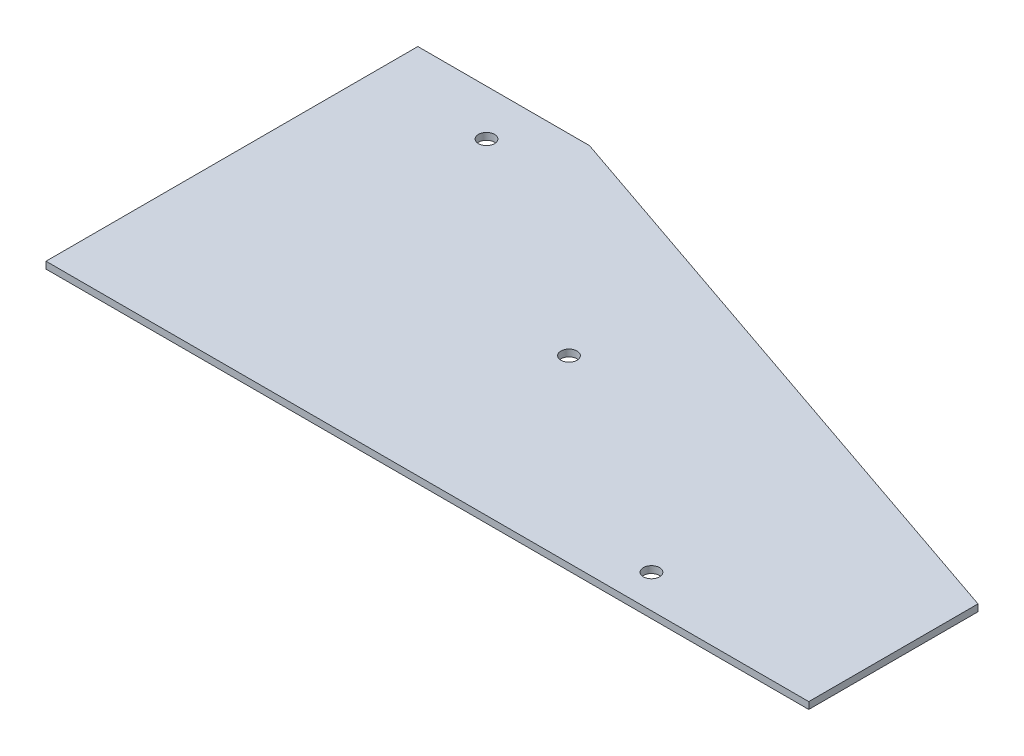
ISO-10303-21;
HEADER;
FILE_DESCRIPTION(('STEP AP214'),'2;1');
FILE_NAME('part.step','',(''),(''),'','','');
FILE_SCHEMA(('AUTOMOTIVE_DESIGN { 1 0 10303 214 1 1 1 1 }'));
ENDSEC;
DATA;
#1=APPLICATION_CONTEXT('core data for automotive mechanical design processes');
#2=APPLICATION_PROTOCOL_DEFINITION('international standard','automotive_design',2000,#1);
#3=PRODUCT_CONTEXT('',#1,'mechanical');
#4=PRODUCT('Part','Part','',(#3));
#5=PRODUCT_RELATED_PRODUCT_CATEGORY('part','',(#4));
#6=PRODUCT_DEFINITION_FORMATION('','',#4);
#7=PRODUCT_DEFINITION_CONTEXT('part definition',#1,'design');
#8=PRODUCT_DEFINITION('design','',#6,#7);
#9=PRODUCT_DEFINITION_SHAPE('','',#8);
#10=(LENGTH_UNIT() NAMED_UNIT(*) SI_UNIT(.MILLI.,.METRE.));
#11=(NAMED_UNIT(*) PLANE_ANGLE_UNIT() SI_UNIT($,.RADIAN.));
#12=(NAMED_UNIT(*) SI_UNIT($,.STERADIAN.) SOLID_ANGLE_UNIT());
#13=UNCERTAINTY_MEASURE_WITH_UNIT(LENGTH_MEASURE(1.E-05),#10,'distance_accuracy_value','');
#14=(GEOMETRIC_REPRESENTATION_CONTEXT(3) GLOBAL_UNCERTAINTY_ASSIGNED_CONTEXT((#13)) GLOBAL_UNIT_ASSIGNED_CONTEXT((#10,
#11,#12)) REPRESENTATION_CONTEXT('',''));
#15=CARTESIAN_POINT('',(0.,0.,0.));
#16=DIRECTION('',(0.,0.,1.));
#17=DIRECTION('',(1.,0.,0.));
#18=AXIS2_PLACEMENT_3D('',#15,#16,#17);
#19=CARTESIAN_POINT('',(0.,18.25625,0.));
#20=DIRECTION('',(1.,0.,0.));
#21=DIRECTION('',(0.,0.,-1.));
#22=AXIS2_PLACEMENT_3D('',#19,#20,#21);
#23=PLANE('',#22);
#24=DIRECTION('',(0.,0.,1.));
#25=VECTOR('',#24,1.);
#26=CARTESIAN_POINT('',(0.,0.,0.));
#27=LINE('',#26,#25);
#28=CARTESIAN_POINT('',(0.,0.,-990.6));
#29=VERTEX_POINT('',#28);
#30=CARTESIAN_POINT('',(0.,0.,0.));
#31=VERTEX_POINT('',#30);
#32=EDGE_CURVE('E106',#29,#31,#27,.T.);
#33=ORIENTED_EDGE('',*,*,#32,.T.);
#34=DIRECTION('',(0.,-1.,0.));
#35=VECTOR('',#34,1.);
#36=CARTESIAN_POINT('',(0.,18.25625,0.));
#37=LINE('',#36,#35);
#38=CARTESIAN_POINT('',(0.,18.25625,0.));
#39=VERTEX_POINT('',#38);
#40=EDGE_CURVE('E11',#39,#31,#37,.T.);
#41=ORIENTED_EDGE('',*,*,#40,.F.);
#42=DIRECTION('',(0.,0.,1.));
#43=VECTOR('',#42,1.);
#44=CARTESIAN_POINT('',(0.,18.25625,0.));
#45=LINE('',#44,#43);
#46=CARTESIAN_POINT('',(0.,18.25625,-990.6));
#47=VERTEX_POINT('',#46);
#48=EDGE_CURVE('E115',#47,#39,#45,.T.);
#49=ORIENTED_EDGE('',*,*,#48,.F.);
#50=DIRECTION('',(0.,-1.,0.));
#51=VECTOR('',#50,1.);
#52=CARTESIAN_POINT('',(0.,18.25625,-990.6));
#53=LINE('',#52,#51);
#54=EDGE_CURVE('E102',#47,#29,#53,.T.);
#55=ORIENTED_EDGE('',*,*,#54,.T.);
#56=EDGE_LOOP('',(#33,#41,#49,#55));
#57=FACE_BOUND('',#56,.T.);
#58=ADVANCED_FACE('F32',(#57),#23,.F.);
#59=CARTESIAN_POINT('',(0.,18.25625,0.));
#60=DIRECTION('',(0.,0.,-1.));
#61=DIRECTION('',(-1.,0.,0.));
#62=AXIS2_PLACEMENT_3D('',#59,#60,#61);
#63=PLANE('',#62);
#64=DIRECTION('',(1.,0.,0.));
#65=VECTOR('',#64,1.);
#66=CARTESIAN_POINT('',(0.,0.,0.));
#67=LINE('',#66,#65);
#68=CARTESIAN_POINT('',(2032.,0.,0.));
#69=VERTEX_POINT('',#68);
#70=EDGE_CURVE('E109',#31,#69,#67,.T.);
#71=ORIENTED_EDGE('',*,*,#70,.T.);
#72=DIRECTION('',(0.,-1.,0.));
#73=VECTOR('',#72,1.);
#74=CARTESIAN_POINT('',(2032.,18.25625,0.));
#75=LINE('',#74,#73);
#76=CARTESIAN_POINT('',(2032.,18.25625,0.));
#77=VERTEX_POINT('',#76);
#78=EDGE_CURVE('E40',#77,#69,#75,.T.);
#79=ORIENTED_EDGE('',*,*,#78,.F.);
#80=DIRECTION('',(1.,0.,0.));
#81=VECTOR('',#80,1.);
#82=CARTESIAN_POINT('',(0.,18.25625,0.));
#83=LINE('',#82,#81);
#84=EDGE_CURVE('E82',#39,#77,#83,.T.);
#85=ORIENTED_EDGE('',*,*,#84,.F.);
#86=ORIENTED_EDGE('',*,*,#40,.T.);
#87=EDGE_LOOP('',(#71,#79,#85,#86));
#88=FACE_BOUND('',#87,.T.);
#89=ADVANCED_FACE('F135',(#88),#63,.F.);
#90=CARTESIAN_POINT('',(2032.,18.25625,-450.85));
#91=DIRECTION('',(-1.,0.,0.));
#92=DIRECTION('',(0.,0.,1.));
#93=AXIS2_PLACEMENT_3D('',#90,#91,#92);
#94=PLANE('',#93);
#95=DIRECTION('',(0.,0.,-1.));
#96=VECTOR('',#95,1.);
#97=CARTESIAN_POINT('',(2032.,0.,-450.85));
#98=LINE('',#97,#96);
#99=CARTESIAN_POINT('',(2032.,0.,-450.85));
#100=VERTEX_POINT('',#99);
#101=EDGE_CURVE('E97',#69,#100,#98,.T.);
#102=ORIENTED_EDGE('',*,*,#101,.T.);
#103=DIRECTION('',(0.,-1.,0.));
#104=VECTOR('',#103,1.);
#105=CARTESIAN_POINT('',(2032.,18.25625,-450.85));
#106=LINE('',#105,#104);
#107=CARTESIAN_POINT('',(2032.,18.25625,-450.85));
#108=VERTEX_POINT('',#107);
#109=EDGE_CURVE('E94',#108,#100,#106,.T.);
#110=ORIENTED_EDGE('',*,*,#109,.F.);
#111=DIRECTION('',(0.,0.,-1.));
#112=VECTOR('',#111,1.);
#113=CARTESIAN_POINT('',(2032.,18.25625,-450.85));
#114=LINE('',#113,#112);
#115=EDGE_CURVE('E86',#77,#108,#114,.T.);
#116=ORIENTED_EDGE('',*,*,#115,.F.);
#117=ORIENTED_EDGE('',*,*,#78,.T.);
#118=EDGE_LOOP('',(#102,#110,#116,#117));
#119=FACE_BOUND('',#118,.T.);
#120=ADVANCED_FACE('F95',(#119),#94,.F.);
#121=CARTESIAN_POINT('',(2032.,18.25625,-450.85));
#122=DIRECTION('',(-0.32422680240075,0.,0.945979376416307));
#123=DIRECTION('',(0.945979376416307,0.,0.32422680240075));
#124=AXIS2_PLACEMENT_3D('',#121,#122,#123);
#125=PLANE('',#124);
#126=DIRECTION('',(-0.945979376416307,0.,-0.32422680240075));
#127=VECTOR('',#126,1.);
#128=CARTESIAN_POINT('',(2032.,0.,-450.85));
#129=LINE('',#128,#127);
#130=CARTESIAN_POINT('',(457.2,0.,-990.6));
#131=VERTEX_POINT('',#130);
#132=EDGE_CURVE('E68',#100,#131,#129,.T.);
#133=ORIENTED_EDGE('',*,*,#132,.T.);
#134=DIRECTION('',(0.,-1.,0.));
#135=VECTOR('',#134,1.);
#136=CARTESIAN_POINT('',(457.2,18.25625,-990.6));
#137=LINE('',#136,#135);
#138=CARTESIAN_POINT('',(457.2,18.25625,-990.6));
#139=VERTEX_POINT('',#138);
#140=EDGE_CURVE('E98',#139,#131,#137,.T.);
#141=ORIENTED_EDGE('',*,*,#140,.F.);
#142=DIRECTION('',(-0.945979376416307,0.,-0.32422680240075));
#143=VECTOR('',#142,1.);
#144=CARTESIAN_POINT('',(2032.,18.25625,-450.85));
#145=LINE('',#144,#143);
#146=EDGE_CURVE('E90',#108,#139,#145,.T.);
#147=ORIENTED_EDGE('',*,*,#146,.F.);
#148=ORIENTED_EDGE('',*,*,#109,.T.);
#149=EDGE_LOOP('',(#133,#141,#147,#148));
#150=FACE_BOUND('',#149,.T.);
#151=ADVANCED_FACE('F100',(#150),#125,.F.);
#152=CARTESIAN_POINT('',(0.,18.25625,-990.6));
#153=DIRECTION('',(0.,0.,1.));
#154=DIRECTION('',(1.,0.,0.));
#155=AXIS2_PLACEMENT_3D('',#152,#153,#154);
#156=PLANE('',#155);
#157=DIRECTION('',(-1.,0.,0.));
#158=VECTOR('',#157,1.);
#159=CARTESIAN_POINT('',(0.,0.,-990.6));
#160=LINE('',#159,#158);
#161=EDGE_CURVE('E74',#131,#29,#160,.T.);
#162=ORIENTED_EDGE('',*,*,#161,.T.);
#163=ORIENTED_EDGE('',*,*,#54,.F.);
#164=DIRECTION('',(-1.,0.,0.));
#165=VECTOR('',#164,1.);
#166=CARTESIAN_POINT('',(0.,18.25625,-990.6));
#167=LINE('',#166,#165);
#168=EDGE_CURVE('E48',#139,#47,#167,.T.);
#169=ORIENTED_EDGE('',*,*,#168,.F.);
#170=ORIENTED_EDGE('',*,*,#140,.T.);
#171=EDGE_LOOP('',(#162,#163,#169,#170));
#172=FACE_BOUND('',#171,.T.);
#173=ADVANCED_FACE('F123',(#172),#156,.F.);
#174=CARTESIAN_POINT('',(0.,18.25625,0.));
#175=DIRECTION('',(0.,-1.,0.));
#176=DIRECTION('',(0.,0.,-1.));
#177=AXIS2_PLACEMENT_3D('',#174,#175,#176);
#178=PLANE('',#177);
#179=CARTESIAN_POINT('',(1524.,18.25625,-88.9));
#180=DIRECTION('',(0.,1.,0.));
#181=DIRECTION('',(0.,0.,1.));
#182=AXIS2_PLACEMENT_3D('',#179,#180,#181);
#183=CIRCLE('',#182,21.463);
#184=CARTESIAN_POINT('',(1524.,18.25625,-67.437));
#185=VERTEX_POINT('',#184);
#186=EDGE_CURVE('E207',#185,#185,#183,.T.);
#187=ORIENTED_EDGE('',*,*,#186,.F.);
#188=EDGE_LOOP('',(#187));
#189=FACE_BOUND('',#188,.T.);
#190=CARTESIAN_POINT('',(914.4,18.25625,-478.79));
#191=DIRECTION('',(0.,1.,0.));
#192=DIRECTION('',(0.,0.,1.));
#193=AXIS2_PLACEMENT_3D('',#190,#191,#192);
#194=CIRCLE('',#193,21.463);
#195=CARTESIAN_POINT('',(914.4,18.25625,-457.327));
#196=VERTEX_POINT('',#195);
#197=EDGE_CURVE('E209',#196,#196,#194,.T.);
#198=ORIENTED_EDGE('',*,*,#197,.F.);
#199=EDGE_LOOP('',(#198));
#200=FACE_BOUND('',#199,.T.);
#201=CARTESIAN_POINT('',(304.8,18.25625,-868.68));
#202=DIRECTION('',(0.,1.,0.));
#203=DIRECTION('',(0.,0.,1.));
#204=AXIS2_PLACEMENT_3D('',#201,#202,#203);
#205=CIRCLE('',#204,21.463);
#206=CARTESIAN_POINT('',(304.8,18.25625,-847.217));
#207=VERTEX_POINT('',#206);
#208=EDGE_CURVE('E217',#207,#207,#205,.T.);
#209=ORIENTED_EDGE('',*,*,#208,.F.);
#210=EDGE_LOOP('',(#209));
#211=FACE_BOUND('',#210,.T.);
#212=ORIENTED_EDGE('',*,*,#48,.T.);
#213=ORIENTED_EDGE('',*,*,#84,.T.);
#214=ORIENTED_EDGE('',*,*,#115,.T.);
#215=ORIENTED_EDGE('',*,*,#146,.T.);
#216=ORIENTED_EDGE('',*,*,#168,.T.);
#217=EDGE_LOOP('',(#212,#213,#214,#215,#216));
#218=FACE_BOUND('',#217,.T.);
#219=ADVANCED_FACE('F88',(#189,#200,#211,#218),#178,.F.);
#220=CARTESIAN_POINT('',(0.,0.,0.));
#221=DIRECTION('',(0.,-1.,0.));
#222=DIRECTION('',(0.,0.,-1.));
#223=AXIS2_PLACEMENT_3D('',#220,#221,#222);
#224=PLANE('',#223);
#225=CARTESIAN_POINT('',(1524.,0.,-88.9));
#226=DIRECTION('',(0.,1.,0.));
#227=DIRECTION('',(0.,0.,1.));
#228=AXIS2_PLACEMENT_3D('',#225,#226,#227);
#229=CIRCLE('',#228,21.463);
#230=CARTESIAN_POINT('',(1524.,0.,-67.437));
#231=VERTEX_POINT('',#230);
#232=EDGE_CURVE('E204',#231,#231,#229,.T.);
#233=ORIENTED_EDGE('',*,*,#232,.T.);
#234=EDGE_LOOP('',(#233));
#235=FACE_BOUND('',#234,.T.);
#236=CARTESIAN_POINT('',(914.4,0.,-478.79));
#237=DIRECTION('',(0.,1.,0.));
#238=DIRECTION('',(0.,0.,1.));
#239=AXIS2_PLACEMENT_3D('',#236,#237,#238);
#240=CIRCLE('',#239,21.463);
#241=CARTESIAN_POINT('',(914.4,0.,-457.327));
#242=VERTEX_POINT('',#241);
#243=EDGE_CURVE('E214',#242,#242,#240,.T.);
#244=ORIENTED_EDGE('',*,*,#243,.T.);
#245=EDGE_LOOP('',(#244));
#246=FACE_BOUND('',#245,.T.);
#247=CARTESIAN_POINT('',(304.8,0.,-868.68));
#248=DIRECTION('',(0.,1.,0.));
#249=DIRECTION('',(0.,0.,1.));
#250=AXIS2_PLACEMENT_3D('',#247,#248,#249);
#251=CIRCLE('',#250,21.463);
#252=CARTESIAN_POINT('',(304.8,0.,-847.217));
#253=VERTEX_POINT('',#252);
#254=EDGE_CURVE('E110',#253,#253,#251,.T.);
#255=ORIENTED_EDGE('',*,*,#254,.T.);
#256=EDGE_LOOP('',(#255));
#257=FACE_BOUND('',#256,.T.);
#258=ORIENTED_EDGE('',*,*,#32,.F.);
#259=ORIENTED_EDGE('',*,*,#161,.F.);
#260=ORIENTED_EDGE('',*,*,#132,.F.);
#261=ORIENTED_EDGE('',*,*,#101,.F.);
#262=ORIENTED_EDGE('',*,*,#70,.F.);
#263=EDGE_LOOP('',(#258,#259,#260,#261,#262));
#264=FACE_BOUND('',#263,.T.);
#265=ADVANCED_FACE('F119',(#235,#246,#257,#264),#224,.T.);
#266=CARTESIAN_POINT('',(304.8,18.25625,-868.68));
#267=DIRECTION('',(0.,1.,0.));
#268=DIRECTION('',(0.,0.,1.));
#269=AXIS2_PLACEMENT_3D('',#266,#267,#268);
#270=CYLINDRICAL_SURFACE('',#269,21.463);
#271=ORIENTED_EDGE('',*,*,#254,.F.);
#272=EDGE_LOOP('',(#271));
#273=FACE_BOUND('',#272,.T.);
#274=ORIENTED_EDGE('',*,*,#208,.T.);
#275=EDGE_LOOP('',(#274));
#276=FACE_BOUND('',#275,.T.);
#277=ADVANCED_FACE('F168',(#273,#276),#270,.F.);
#278=CARTESIAN_POINT('',(914.4,18.25625,-478.79));
#279=DIRECTION('',(0.,1.,0.));
#280=DIRECTION('',(0.,0.,1.));
#281=AXIS2_PLACEMENT_3D('',#278,#279,#280);
#282=CYLINDRICAL_SURFACE('',#281,21.463);
#283=ORIENTED_EDGE('',*,*,#243,.F.);
#284=EDGE_LOOP('',(#283));
#285=FACE_BOUND('',#284,.T.);
#286=ORIENTED_EDGE('',*,*,#197,.T.);
#287=EDGE_LOOP('',(#286));
#288=FACE_BOUND('',#287,.T.);
#289=ADVANCED_FACE('F177',(#285,#288),#282,.F.);
#290=CARTESIAN_POINT('',(1524.,18.25625,-88.9));
#291=DIRECTION('',(0.,1.,0.));
#292=DIRECTION('',(0.,0.,1.));
#293=AXIS2_PLACEMENT_3D('',#290,#291,#292);
#294=CYLINDRICAL_SURFACE('',#293,21.463);
#295=ORIENTED_EDGE('',*,*,#232,.F.);
#296=EDGE_LOOP('',(#295));
#297=FACE_BOUND('',#296,.T.);
#298=ORIENTED_EDGE('',*,*,#186,.T.);
#299=EDGE_LOOP('',(#298));
#300=FACE_BOUND('',#299,.T.);
#301=ADVANCED_FACE('F187',(#297,#300),#294,.F.);
#302=CLOSED_SHELL('',(#58,#89,#120,#151,#173,#219,#265,#277,#289,#301));
#303=MANIFOLD_SOLID_BREP('B2',#302);
#304=ADVANCED_BREP_SHAPE_REPRESENTATION('',(#18,#303),#14);
#305=SHAPE_DEFINITION_REPRESENTATION(#9,#304);
ENDSEC;
END-ISO-10303-21;
